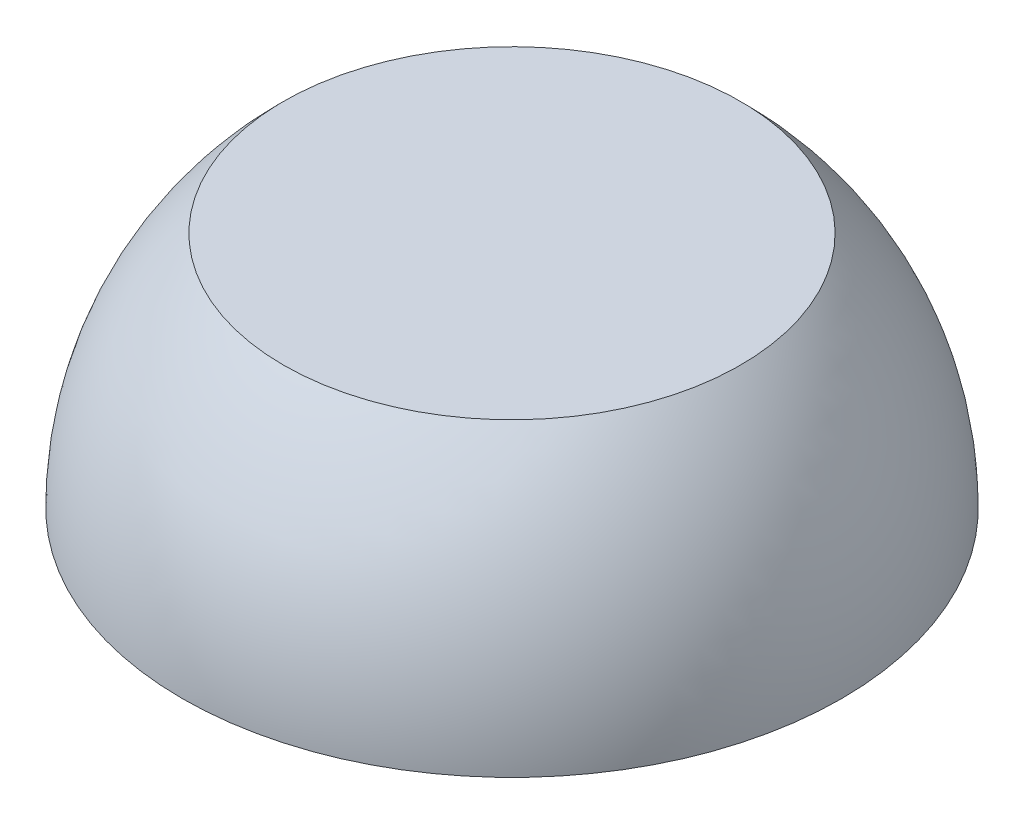
ISO-10303-21;
HEADER;
FILE_DESCRIPTION(('STEP AP214'),'2;1');
FILE_NAME('part.step','',(''),(''),'','','');
FILE_SCHEMA(('AUTOMOTIVE_DESIGN { 1 0 10303 214 1 1 1 1 }'));
ENDSEC;
DATA;
#1=APPLICATION_CONTEXT('core data for automotive mechanical design processes');
#2=APPLICATION_PROTOCOL_DEFINITION('international standard','automotive_design',2000,#1);
#3=PRODUCT_CONTEXT('',#1,'mechanical');
#4=PRODUCT('Part','Part','',(#3));
#5=PRODUCT_RELATED_PRODUCT_CATEGORY('part','',(#4));
#6=PRODUCT_DEFINITION_FORMATION('','',#4);
#7=PRODUCT_DEFINITION_CONTEXT('part definition',#1,'design');
#8=PRODUCT_DEFINITION('design','',#6,#7);
#9=PRODUCT_DEFINITION_SHAPE('','',#8);
#10=(LENGTH_UNIT() NAMED_UNIT(*) SI_UNIT(.MILLI.,.METRE.));
#11=(NAMED_UNIT(*) PLANE_ANGLE_UNIT() SI_UNIT($,.RADIAN.));
#12=(NAMED_UNIT(*) SI_UNIT($,.STERADIAN.) SOLID_ANGLE_UNIT());
#13=UNCERTAINTY_MEASURE_WITH_UNIT(LENGTH_MEASURE(1.E-05),#10,'distance_accuracy_value','');
#14=(GEOMETRIC_REPRESENTATION_CONTEXT(3) GLOBAL_UNCERTAINTY_ASSIGNED_CONTEXT((#13)) GLOBAL_UNIT_ASSIGNED_CONTEXT((#10,
#11,#12)) REPRESENTATION_CONTEXT('',''));
#15=CARTESIAN_POINT('',(0.,0.,0.));
#16=DIRECTION('',(0.,0.,1.));
#17=DIRECTION('',(1.,0.,0.));
#18=AXIS2_PLACEMENT_3D('',#15,#16,#17);
#19=CARTESIAN_POINT('',(0.,-7.4275188249565,0.));
#20=DIRECTION('',(0.,1.,0.));
#21=DIRECTION('',(0.,0.,1.));
#22=AXIS2_PLACEMENT_3D('',#19,#20,#21);
#23=DEGENERATE_TOROIDAL_SURFACE('',#22,0.00999999999999959,2.91,.F.);
#24=CARTESIAN_POINT('',(0.,-5.33258442073351,0.));
#25=DIRECTION('',(0.,1.,0.));
#26=DIRECTION('',(0.,0.,1.));
#27=AXIS2_PLACEMENT_3D('',#24,#25,#26);
#28=CIRCLE('',#27,2.00974004317458);
#29=CARTESIAN_POINT('',(0.,-5.33258442073351,2.00974004317458));
#30=VERTEX_POINT('',#29);
#31=EDGE_CURVE('E10',#30,#30,#28,.T.);
#32=ORIENTED_EDGE('',*,*,#31,.F.);
#33=EDGE_LOOP('',(#32));
#34=FACE_BOUND('',#33,.T.);
#35=CARTESIAN_POINT('',(0.,-7.4275188249565,0.));
#36=DIRECTION('',(0.,1.,0.));
#37=DIRECTION('',(0.,0.,1.));
#38=AXIS2_PLACEMENT_3D('',#35,#36,#37);
#39=CIRCLE('',#38,2.9);
#40=CARTESIAN_POINT('',(0.,-7.4275188249565,2.9));
#41=VERTEX_POINT('',#40);
#42=EDGE_CURVE('E50',#41,#41,#39,.T.);
#43=ORIENTED_EDGE('',*,*,#42,.T.);
#44=EDGE_LOOP('',(#43));
#45=FACE_BOUND('',#44,.T.);
#46=ADVANCED_FACE('F43',(#34,#45),#23,.F.);
#47=CARTESIAN_POINT('',(2.00974004317458,-5.33258442073351,0.));
#48=DIRECTION('',(0.,-1.,0.));
#49=DIRECTION('',(0.,0.,-1.));
#50=AXIS2_PLACEMENT_3D('',#47,#48,#49);
#51=PLANE('',#50);
#52=ORIENTED_EDGE('',*,*,#31,.T.);
#53=EDGE_LOOP('',(#52));
#54=FACE_BOUND('',#53,.T.);
#55=ADVANCED_FACE('F60',(#54),#51,.F.);
#56=CARTESIAN_POINT('',(2.9,-7.4275188249565,0.));
#57=DIRECTION('',(0.,1.,0.));
#58=DIRECTION('',(0.,0.,1.));
#59=AXIS2_PLACEMENT_3D('',#56,#57,#58);
#60=PLANE('',#59);
#61=ORIENTED_EDGE('',*,*,#42,.F.);
#62=EDGE_LOOP('',(#61));
#63=FACE_BOUND('',#62,.T.);
#64=ADVANCED_FACE('F58',(#63),#60,.F.);
#65=CLOSED_SHELL('',(#46,#55,#64));
#66=MANIFOLD_SOLID_BREP('B2',#65);
#67=ADVANCED_BREP_SHAPE_REPRESENTATION('',(#18,#66),#14);
#68=SHAPE_DEFINITION_REPRESENTATION(#9,#67);
ENDSEC;
END-ISO-10303-21;
